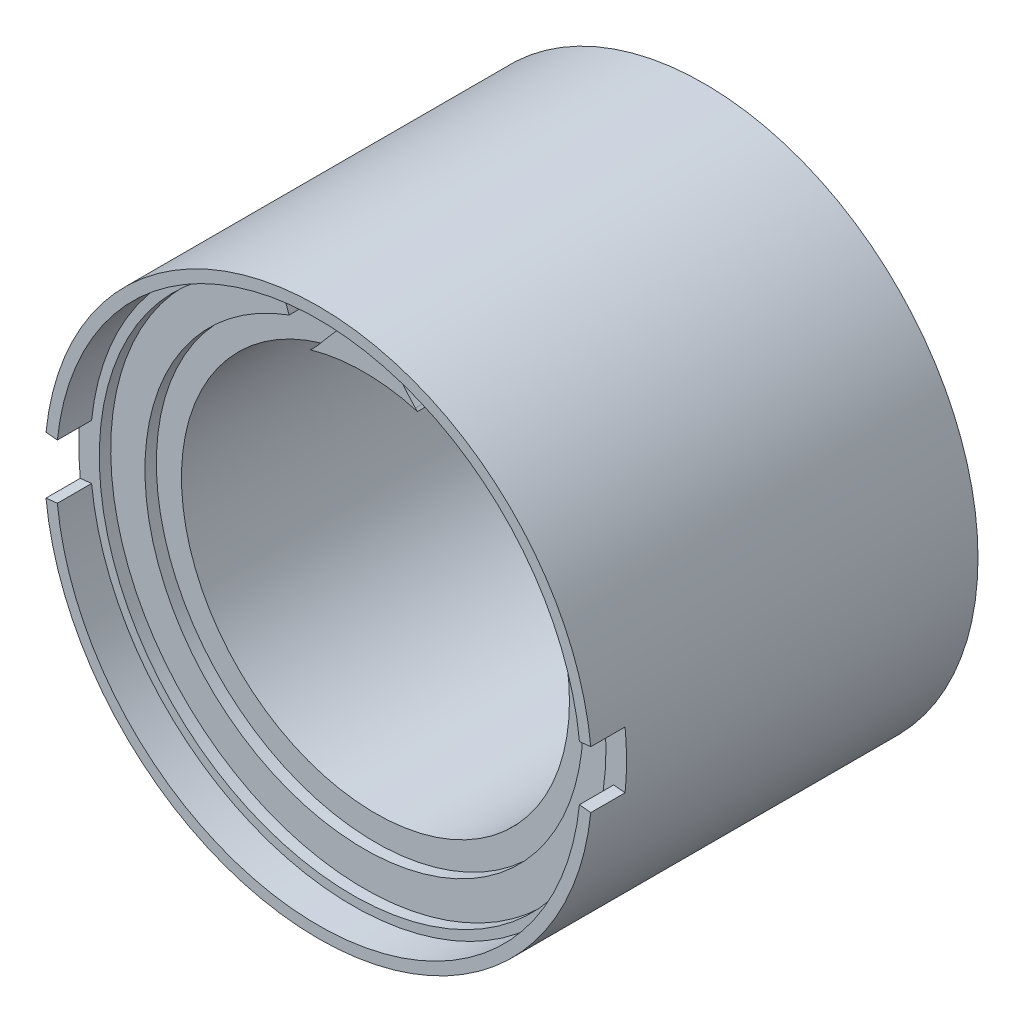
ISO-10303-21;
HEADER;
FILE_DESCRIPTION(('STEP AP214'),'2;1');
FILE_NAME('part.step','',(''),(''),'','','');
FILE_SCHEMA(('AUTOMOTIVE_DESIGN { 1 0 10303 214 1 1 1 1 }'));
ENDSEC;
DATA;
#1=APPLICATION_CONTEXT('core data for automotive mechanical design processes');
#2=APPLICATION_PROTOCOL_DEFINITION('international standard','automotive_design',2000,#1);
#3=PRODUCT_CONTEXT('',#1,'mechanical');
#4=PRODUCT('Part','Part','',(#3));
#5=PRODUCT_RELATED_PRODUCT_CATEGORY('part','',(#4));
#6=PRODUCT_DEFINITION_FORMATION('','',#4);
#7=PRODUCT_DEFINITION_CONTEXT('part definition',#1,'design');
#8=PRODUCT_DEFINITION('design','',#6,#7);
#9=PRODUCT_DEFINITION_SHAPE('','',#8);
#10=(LENGTH_UNIT() NAMED_UNIT(*) SI_UNIT(.MILLI.,.METRE.));
#11=(NAMED_UNIT(*) PLANE_ANGLE_UNIT() SI_UNIT($,.RADIAN.));
#12=(NAMED_UNIT(*) SI_UNIT($,.STERADIAN.) SOLID_ANGLE_UNIT());
#13=UNCERTAINTY_MEASURE_WITH_UNIT(LENGTH_MEASURE(1.E-05),#10,'distance_accuracy_value','');
#14=(GEOMETRIC_REPRESENTATION_CONTEXT(3) GLOBAL_UNCERTAINTY_ASSIGNED_CONTEXT((#13)) GLOBAL_UNIT_ASSIGNED_CONTEXT((#10,
#11,#12)) REPRESENTATION_CONTEXT('',''));
#15=CARTESIAN_POINT('',(0.,0.,0.));
#16=DIRECTION('',(0.,0.,1.));
#17=DIRECTION('',(1.,0.,0.));
#18=AXIS2_PLACEMENT_3D('',#15,#16,#17);
#19=CARTESIAN_POINT('',(0.,0.,1072.38147752167));
#20=DIRECTION('',(0.,0.,1.));
#21=DIRECTION('',(1.,0.,0.));
#22=AXIS2_PLACEMENT_3D('',#19,#20,#21);
#23=CYLINDRICAL_SURFACE('',#22,24.);
#24=CARTESIAN_POINT('',(0.,0.,0.));
#25=DIRECTION('',(0.,0.,1.));
#26=DIRECTION('',(1.,0.,0.));
#27=AXIS2_PLACEMENT_3D('',#24,#25,#26);
#28=CIRCLE('',#27,24.);
#29=CARTESIAN_POINT('',(24.,0.,0.));
#30=VERTEX_POINT('',#29);
#31=EDGE_CURVE('E235',#30,#30,#28,.T.);
#32=ORIENTED_EDGE('',*,*,#31,.T.);
#33=EDGE_LOOP('',(#32));
#34=FACE_BOUND('',#33,.T.);
#35=CARTESIAN_POINT('',(0.,0.,30.8));
#36=DIRECTION('',(0.,0.,1.));
#37=DIRECTION('',(1.,0.,0.));
#38=AXIS2_PLACEMENT_3D('',#35,#36,#37);
#39=CIRCLE('',#38,24.);
#40=CARTESIAN_POINT('',(23.86943652456,-2.5,30.8));
#41=VERTEX_POINT('',#40);
#42=CARTESIAN_POINT('',(23.86943652456,2.5,30.8));
#43=VERTEX_POINT('',#42);
#44=EDGE_CURVE('E174',#41,#43,#39,.T.);
#45=ORIENTED_EDGE('',*,*,#44,.F.);
#46=DIRECTION('',(0.,0.,1.));
#47=VECTOR('',#46,1.);
#48=CARTESIAN_POINT('',(23.86943652456,-2.5,30.8));
#49=LINE('',#48,#47);
#50=CARTESIAN_POINT('',(23.86943652456,-2.5,33.8));
#51=VERTEX_POINT('',#50);
#52=EDGE_CURVE('E498',#41,#51,#49,.T.);
#53=ORIENTED_EDGE('',*,*,#52,.T.);
#54=CARTESIAN_POINT('',(0.,0.,33.8));
#55=DIRECTION('',(0.,0.,1.));
#56=DIRECTION('',(1.,0.,0.));
#57=AXIS2_PLACEMENT_3D('',#54,#55,#56);
#58=CIRCLE('',#57,24.);
#59=CARTESIAN_POINT('',(-23.86943652456,-2.5,33.8));
#60=VERTEX_POINT('',#59);
#61=EDGE_CURVE('E230',#60,#51,#58,.T.);
#62=ORIENTED_EDGE('',*,*,#61,.F.);
#63=DIRECTION('',(0.,0.,1.));
#64=VECTOR('',#63,1.);
#65=CARTESIAN_POINT('',(-23.86943652456,-2.5,30.8));
#66=LINE('',#65,#64);
#67=CARTESIAN_POINT('',(-23.86943652456,-2.5,30.8));
#68=VERTEX_POINT('',#67);
#69=EDGE_CURVE('E207',#68,#60,#66,.T.);
#70=ORIENTED_EDGE('',*,*,#69,.F.);
#71=CARTESIAN_POINT('',(0.,0.,30.8));
#72=DIRECTION('',(0.,0.,1.));
#73=DIRECTION('',(1.,0.,0.));
#74=AXIS2_PLACEMENT_3D('',#71,#72,#73);
#75=CIRCLE('',#74,24.);
#76=CARTESIAN_POINT('',(-23.86943652456,2.5,30.8));
#77=VERTEX_POINT('',#76);
#78=EDGE_CURVE('E197',#77,#68,#75,.T.);
#79=ORIENTED_EDGE('',*,*,#78,.F.);
#80=DIRECTION('',(0.,0.,1.));
#81=VECTOR('',#80,1.);
#82=CARTESIAN_POINT('',(-23.86943652456,2.5,30.8));
#83=LINE('',#82,#81);
#84=CARTESIAN_POINT('',(-23.86943652456,2.5,33.8));
#85=VERTEX_POINT('',#84);
#86=EDGE_CURVE('E213',#77,#85,#83,.T.);
#87=ORIENTED_EDGE('',*,*,#86,.T.);
#88=CARTESIAN_POINT('',(23.86943652456,2.5,33.8));
#89=VERTEX_POINT('',#88);
#90=EDGE_CURVE('E187',#89,#85,#58,.T.);
#91=ORIENTED_EDGE('',*,*,#90,.F.);
#92=DIRECTION('',(0.,0.,1.));
#93=VECTOR('',#92,1.);
#94=CARTESIAN_POINT('',(23.86943652456,2.5,30.8));
#95=LINE('',#94,#93);
#96=EDGE_CURVE('E167',#43,#89,#95,.T.);
#97=ORIENTED_EDGE('',*,*,#96,.F.);
#98=EDGE_LOOP('',(#45,#53,#62,#70,#79,#87,#91,#97));
#99=FACE_BOUND('',#98,.T.);
#100=ADVANCED_FACE('F41',(#34,#99),#23,.T.);
#101=CARTESIAN_POINT('',(0.,0.,33.8));
#102=DIRECTION('',(0.,0.,1.));
#103=DIRECTION('',(1.,0.,0.));
#104=AXIS2_PLACEMENT_3D('',#101,#102,#103);
#105=PLANE('',#104);
#106=ORIENTED_EDGE('',*,*,#61,.T.);
#107=DIRECTION('',(-0.994559855190001,0.104166666666667,0.));
#108=VECTOR('',#107,1.);
#109=CARTESIAN_POINT('',(0.,0.,33.8));
#110=LINE('',#109,#108);
#111=CARTESIAN_POINT('',(22.87487666937,-2.39583333333333,33.8));
#112=VERTEX_POINT('',#111);
#113=EDGE_CURVE('E182',#51,#112,#110,.T.);
#114=ORIENTED_EDGE('',*,*,#113,.T.);
#115=CARTESIAN_POINT('',(0.,0.,33.8));
#116=DIRECTION('',(0.,0.,1.));
#117=DIRECTION('',(1.,0.,0.));
#118=AXIS2_PLACEMENT_3D('',#115,#116,#117);
#119=CIRCLE('',#118,23.);
#120=CARTESIAN_POINT('',(-22.87487666937,-2.39583333333333,33.8));
#121=VERTEX_POINT('',#120);
#122=EDGE_CURVE('E231',#121,#112,#119,.T.);
#123=ORIENTED_EDGE('',*,*,#122,.F.);
#124=DIRECTION('',(0.994559855190001,0.104166666666667,0.));
#125=VECTOR('',#124,1.);
#126=CARTESIAN_POINT('',(0.,0.,33.8));
#127=LINE('',#126,#125);
#128=EDGE_CURVE('E208',#60,#121,#127,.T.);
#129=ORIENTED_EDGE('',*,*,#128,.F.);
#130=EDGE_LOOP('',(#106,#114,#123,#129));
#131=FACE_BOUND('',#130,.T.);
#132=ADVANCED_FACE('F388',(#131),#105,.T.);
#133=CARTESIAN_POINT('',(22.87487666937,2.39583333333333,33.8));
#134=VERTEX_POINT('',#133);
#135=CARTESIAN_POINT('',(-22.87487666937,2.39583333333333,33.8));
#136=VERTEX_POINT('',#135);
#137=EDGE_CURVE('E226',#134,#136,#119,.T.);
#138=ORIENTED_EDGE('',*,*,#137,.F.);
#139=DIRECTION('',(0.994559855190001,0.104166666666667,0.));
#140=VECTOR('',#139,1.);
#141=CARTESIAN_POINT('',(0.,0.,33.8));
#142=LINE('',#141,#140);
#143=EDGE_CURVE('E216',#134,#89,#142,.T.);
#144=ORIENTED_EDGE('',*,*,#143,.T.);
#145=ORIENTED_EDGE('',*,*,#90,.T.);
#146=DIRECTION('',(-0.994559855190001,0.104166666666667,0.));
#147=VECTOR('',#146,1.);
#148=CARTESIAN_POINT('',(0.,0.,33.8));
#149=LINE('',#148,#147);
#150=EDGE_CURVE('E200',#136,#85,#149,.T.);
#151=ORIENTED_EDGE('',*,*,#150,.F.);
#152=EDGE_LOOP('',(#138,#144,#145,#151));
#153=FACE_BOUND('',#152,.T.);
#154=ADVANCED_FACE('F394',(#153),#105,.T.);
#155=CARTESIAN_POINT('',(0.,0.,33.8));
#156=DIRECTION('',(0.,0.,-1.));
#157=DIRECTION('',(-1.,0.,0.));
#158=AXIS2_PLACEMENT_3D('',#155,#156,#157);
#159=CYLINDRICAL_SURFACE('',#158,23.);
#160=ORIENTED_EDGE('',*,*,#122,.T.);
#161=DIRECTION('',(0.,0.,1.));
#162=VECTOR('',#161,1.);
#163=CARTESIAN_POINT('',(22.87487666937,-2.39583333333333,30.8));
#164=LINE('',#163,#162);
#165=CARTESIAN_POINT('',(22.87487666937,-2.39583333333333,30.8));
#166=VERTEX_POINT('',#165);
#167=EDGE_CURVE('E192',#166,#112,#164,.T.);
#168=ORIENTED_EDGE('',*,*,#167,.F.);
#169=CARTESIAN_POINT('',(0.,0.,30.8));
#170=DIRECTION('',(0.,0.,1.));
#171=DIRECTION('',(1.,0.,0.));
#172=AXIS2_PLACEMENT_3D('',#169,#170,#171);
#173=CIRCLE('',#172,23.);
#174=CARTESIAN_POINT('',(-22.87487666937,-2.39583333333333,30.8));
#175=VERTEX_POINT('',#174);
#176=EDGE_CURVE('E11',#166,#175,#173,.F.);
#177=ORIENTED_EDGE('',*,*,#176,.T.);
#178=DIRECTION('',(0.,0.,1.));
#179=VECTOR('',#178,1.);
#180=CARTESIAN_POINT('',(-22.87487666937,-2.39583333333333,30.8));
#181=LINE('',#180,#179);
#182=EDGE_CURVE('E220',#175,#121,#181,.T.);
#183=ORIENTED_EDGE('',*,*,#182,.T.);
#184=EDGE_LOOP('',(#160,#168,#177,#183));
#185=FACE_BOUND('',#184,.T.);
#186=ADVANCED_FACE('F518',(#185),#159,.F.);
#187=CARTESIAN_POINT('',(-22.87487666937,2.39583333333333,30.8));
#188=VERTEX_POINT('',#187);
#189=CARTESIAN_POINT('',(22.87487666937,2.39583333333333,30.8));
#190=VERTEX_POINT('',#189);
#191=EDGE_CURVE('E49',#188,#190,#173,.F.);
#192=ORIENTED_EDGE('',*,*,#191,.T.);
#193=DIRECTION('',(0.,0.,1.));
#194=VECTOR('',#193,1.);
#195=CARTESIAN_POINT('',(22.87487666937,2.39583333333333,30.8));
#196=LINE('',#195,#194);
#197=EDGE_CURVE('E170',#190,#134,#196,.T.);
#198=ORIENTED_EDGE('',*,*,#197,.T.);
#199=ORIENTED_EDGE('',*,*,#137,.T.);
#200=DIRECTION('',(0.,0.,1.));
#201=VECTOR('',#200,1.);
#202=CARTESIAN_POINT('',(-22.87487666937,2.39583333333333,30.8));
#203=LINE('',#202,#201);
#204=EDGE_CURVE('E217',#188,#136,#203,.T.);
#205=ORIENTED_EDGE('',*,*,#204,.F.);
#206=EDGE_LOOP('',(#192,#198,#199,#205));
#207=FACE_BOUND('',#206,.T.);
#208=ADVANCED_FACE('F384',(#207),#159,.F.);
#209=CARTESIAN_POINT('',(0.,0.,30.8));
#210=DIRECTION('',(0.,0.,1.));
#211=DIRECTION('',(1.,0.,0.));
#212=AXIS2_PLACEMENT_3D('',#209,#210,#211);
#213=PLANE('',#212);
#214=CARTESIAN_POINT('',(0.,0.,30.8));
#215=DIRECTION('',(0.,0.,1.));
#216=DIRECTION('',(1.,0.,0.));
#217=AXIS2_PLACEMENT_3D('',#214,#215,#216);
#218=CIRCLE('',#217,22.2);
#219=CARTESIAN_POINT('',(22.2,0.,30.8));
#220=VERTEX_POINT('',#219);
#221=EDGE_CURVE('E234',#220,#220,#218,.F.);
#222=ORIENTED_EDGE('',*,*,#221,.T.);
#223=EDGE_LOOP('',(#222));
#224=FACE_BOUND('',#223,.T.);
#225=ORIENTED_EDGE('',*,*,#176,.F.);
#226=DIRECTION('',(-0.994559855190001,0.104166666666667,0.));
#227=VECTOR('',#226,1.);
#228=CARTESIAN_POINT('',(0.,0.,30.8));
#229=LINE('',#228,#227);
#230=EDGE_CURVE('E173',#41,#166,#229,.T.);
#231=ORIENTED_EDGE('',*,*,#230,.F.);
#232=ORIENTED_EDGE('',*,*,#44,.T.);
#233=DIRECTION('',(0.994559855190001,0.104166666666667,0.));
#234=VECTOR('',#233,1.);
#235=CARTESIAN_POINT('',(0.,0.,30.8));
#236=LINE('',#235,#234);
#237=EDGE_CURVE('E56',#190,#43,#236,.T.);
#238=ORIENTED_EDGE('',*,*,#237,.F.);
#239=ORIENTED_EDGE('',*,*,#191,.F.);
#240=DIRECTION('',(-0.994559855190001,0.104166666666667,0.));
#241=VECTOR('',#240,1.);
#242=CARTESIAN_POINT('',(0.,0.,30.8));
#243=LINE('',#242,#241);
#244=EDGE_CURVE('E203',#188,#77,#243,.T.);
#245=ORIENTED_EDGE('',*,*,#244,.T.);
#246=ORIENTED_EDGE('',*,*,#78,.T.);
#247=DIRECTION('',(0.994559855190001,0.104166666666667,0.));
#248=VECTOR('',#247,1.);
#249=CARTESIAN_POINT('',(0.,0.,30.8));
#250=LINE('',#249,#248);
#251=EDGE_CURVE('E63',#68,#175,#250,.T.);
#252=ORIENTED_EDGE('',*,*,#251,.T.);
#253=EDGE_LOOP('',(#225,#231,#232,#238,#239,#245,#246,#252));
#254=FACE_BOUND('',#253,.T.);
#255=ADVANCED_FACE('F178',(#224,#254),#213,.T.);
#256=CARTESIAN_POINT('',(0.,0.,28.8));
#257=DIRECTION('',(0.,0.,1.));
#258=DIRECTION('',(1.,0.,0.));
#259=AXIS2_PLACEMENT_3D('',#256,#257,#258);
#260=CYLINDRICAL_SURFACE('',#259,22.2);
#261=CARTESIAN_POINT('',(0.,0.,29.8));
#262=DIRECTION('',(0.,0.,1.));
#263=DIRECTION('',(1.,0.,0.));
#264=AXIS2_PLACEMENT_3D('',#261,#262,#263);
#265=CIRCLE('',#264,22.2);
#266=CARTESIAN_POINT('',(-7.5928471818306,20.8611761814471,29.8));
#267=VERTEX_POINT('',#266);
#268=CARTESIAN_POINT('',(7.59284718183028,20.8611761814471,29.8));
#269=VERTEX_POINT('',#268);
#270=EDGE_CURVE('E323',#267,#269,#265,.T.);
#271=ORIENTED_EDGE('',*,*,#270,.F.);
#272=DIRECTION('',(0.,0.,1.));
#273=VECTOR('',#272,1.);
#274=CARTESIAN_POINT('',(-7.5928471818306,20.8611761814471,28.8));
#275=LINE('',#274,#273);
#276=CARTESIAN_POINT('',(-7.5928471818306,20.8611761814471,28.8));
#277=VERTEX_POINT('',#276);
#278=EDGE_CURVE('E437',#277,#267,#275,.T.);
#279=ORIENTED_EDGE('',*,*,#278,.F.);
#280=CARTESIAN_POINT('',(0.,0.,28.8));
#281=DIRECTION('',(0.,0.,1.));
#282=DIRECTION('',(1.,0.,0.));
#283=AXIS2_PLACEMENT_3D('',#280,#281,#282);
#284=CIRCLE('',#283,22.2);
#285=CARTESIAN_POINT('',(7.59284718183028,20.8611761814471,28.8));
#286=VERTEX_POINT('',#285);
#287=EDGE_CURVE('E260',#286,#277,#284,.T.);
#288=ORIENTED_EDGE('',*,*,#287,.F.);
#289=DIRECTION('',(0.,0.,1.));
#290=VECTOR('',#289,1.);
#291=CARTESIAN_POINT('',(7.59284718183028,20.8611761814471,28.8));
#292=LINE('',#291,#290);
#293=EDGE_CURVE('E440',#286,#269,#292,.T.);
#294=ORIENTED_EDGE('',*,*,#293,.T.);
#295=EDGE_LOOP('',(#271,#279,#288,#294));
#296=FACE_BOUND('',#295,.T.);
#297=ORIENTED_EDGE('',*,*,#221,.F.);
#298=EDGE_LOOP('',(#297));
#299=FACE_BOUND('',#298,.T.);
#300=ADVANCED_FACE('F360',(#296,#299),#260,.F.);
#301=CARTESIAN_POINT('',(0.,0.,1072.38147752167));
#302=DIRECTION('',(0.,0.,1.));
#303=DIRECTION('',(1.,0.,0.));
#304=AXIS2_PLACEMENT_3D('',#301,#302,#303);
#305=CYLINDRICAL_SURFACE('',#304,17.);
#306=CARTESIAN_POINT('',(0.,0.,1.80000000000002));
#307=DIRECTION('',(0.,0.,1.));
#308=DIRECTION('',(1.,0.,0.));
#309=AXIS2_PLACEMENT_3D('',#306,#307,#308);
#310=CIRCLE('',#309,17.);
#311=CARTESIAN_POINT('',(17.,0.,1.80000000000002));
#312=VERTEX_POINT('',#311);
#313=EDGE_CURVE('E239',#312,#312,#310,.T.);
#314=ORIENTED_EDGE('',*,*,#313,.F.);
#315=EDGE_LOOP('',(#314));
#316=FACE_BOUND('',#315,.T.);
#317=CARTESIAN_POINT('',(0.,0.,29.8));
#318=DIRECTION('',(0.,0.,1.));
#319=DIRECTION('',(1.,0.,0.));
#320=AXIS2_PLACEMENT_3D('',#317,#318,#319);
#321=CIRCLE('',#320,17.);
#322=CARTESIAN_POINT('',(-4.68397596917369,16.3419817990415,29.8));
#323=VERTEX_POINT('',#322);
#324=CARTESIAN_POINT('',(4.68397596917369,16.3419817990415,29.8));
#325=VERTEX_POINT('',#324);
#326=EDGE_CURVE('E285',#323,#325,#321,.F.);
#327=ORIENTED_EDGE('',*,*,#326,.F.);
#328=DIRECTION('',(0.,0.,1.));
#329=VECTOR('',#328,1.);
#330=CARTESIAN_POINT('',(-4.68397596917369,16.3419817990415,28.8));
#331=LINE('',#330,#329);
#332=CARTESIAN_POINT('',(-4.68397596917369,16.3419817990415,28.8));
#333=VERTEX_POINT('',#332);
#334=EDGE_CURVE('E454',#333,#323,#331,.T.);
#335=ORIENTED_EDGE('',*,*,#334,.F.);
#336=CARTESIAN_POINT('',(0.,0.,28.8));
#337=DIRECTION('',(0.,0.,1.));
#338=DIRECTION('',(1.,0.,0.));
#339=AXIS2_PLACEMENT_3D('',#336,#337,#338);
#340=CIRCLE('',#339,17.);
#341=CARTESIAN_POINT('',(4.68397596917369,16.3419817990415,28.8));
#342=VERTEX_POINT('',#341);
#343=EDGE_CURVE('E271',#333,#342,#340,.T.);
#344=ORIENTED_EDGE('',*,*,#343,.T.);
#345=DIRECTION('',(0.,0.,1.));
#346=VECTOR('',#345,1.);
#347=CARTESIAN_POINT('',(4.68397596917369,16.3419817990415,28.8));
#348=LINE('',#347,#346);
#349=EDGE_CURVE('E458',#342,#325,#348,.T.);
#350=ORIENTED_EDGE('',*,*,#349,.T.);
#351=EDGE_LOOP('',(#327,#335,#344,#350));
#352=FACE_BOUND('',#351,.T.);
#353=ADVANCED_FACE('F356',(#316,#352),#305,.F.);
#354=CARTESIAN_POINT('',(0.,0.,28.8));
#355=DIRECTION('',(0.939692620785902,-0.342020143325687,0.));
#356=DIRECTION('',(0.342020143325687,0.939692620785902,0.));
#357=AXIS2_PLACEMENT_3D('',#354,#355,#356);
#358=PLANE('',#357);
#359=DIRECTION('',(0.342020143325687,0.939692620785902,0.));
#360=VECTOR('',#359,1.);
#361=CARTESIAN_POINT('',(0.,0.,29.8));
#362=LINE('',#361,#360);
#363=CARTESIAN_POINT('',(6.56678675185322,18.0420983190894,29.8));
#364=VERTEX_POINT('',#363);
#365=EDGE_CURVE('E319',#364,#269,#362,.T.);
#366=ORIENTED_EDGE('',*,*,#365,.T.);
#367=ORIENTED_EDGE('',*,*,#293,.F.);
#368=DIRECTION('',(0.342020143325687,0.939692620785902,0.));
#369=VECTOR('',#368,1.);
#370=CARTESIAN_POINT('',(0.,0.,28.8));
#371=LINE('',#370,#369);
#372=CARTESIAN_POINT('',(6.56678675185322,18.0420983190894,28.8));
#373=VERTEX_POINT('',#372);
#374=EDGE_CURVE('E264',#373,#286,#371,.T.);
#375=ORIENTED_EDGE('',*,*,#374,.F.);
#376=DIRECTION('',(0.,0.,1.));
#377=VECTOR('',#376,1.);
#378=CARTESIAN_POINT('',(6.56678675185322,18.0420983190894,28.8));
#379=LINE('',#378,#377);
#380=EDGE_CURVE('E251',#373,#364,#379,.T.);
#381=ORIENTED_EDGE('',*,*,#380,.T.);
#382=EDGE_LOOP('',(#366,#367,#375,#381));
#383=FACE_BOUND('',#382,.T.);
#384=ADVANCED_FACE('F359',(#383),#358,.F.);
#385=CARTESIAN_POINT('',(0.,0.,28.8));
#386=DIRECTION('',(0.,0.,1.));
#387=DIRECTION('',(1.,0.,0.));
#388=AXIS2_PLACEMENT_3D('',#385,#386,#387);
#389=CYLINDRICAL_SURFACE('',#388,19.2);
#390=DIRECTION('',(0.,0.,1.));
#391=VECTOR('',#390,1.);
#392=CARTESIAN_POINT('',(-6.56678675185351,18.0420983190894,28.8));
#393=LINE('',#392,#391);
#394=CARTESIAN_POINT('',(-6.56678675185351,18.0420983190894,28.8));
#395=VERTEX_POINT('',#394);
#396=CARTESIAN_POINT('',(-6.56678675185351,18.0420983190894,29.8));
#397=VERTEX_POINT('',#396);
#398=EDGE_CURVE('E441',#395,#397,#393,.T.);
#399=ORIENTED_EDGE('',*,*,#398,.T.);
#400=CARTESIAN_POINT('',(0.,0.,29.8));
#401=DIRECTION('',(0.,0.,1.));
#402=DIRECTION('',(1.,0.,0.));
#403=AXIS2_PLACEMENT_3D('',#400,#401,#402);
#404=CIRCLE('',#403,19.2);
#405=EDGE_CURVE('E316',#364,#397,#404,.F.);
#406=ORIENTED_EDGE('',*,*,#405,.F.);
#407=ORIENTED_EDGE('',*,*,#380,.F.);
#408=CARTESIAN_POINT('',(0.,0.,28.8));
#409=DIRECTION('',(0.,0.,1.));
#410=DIRECTION('',(1.,0.,0.));
#411=AXIS2_PLACEMENT_3D('',#408,#409,#410);
#412=CIRCLE('',#411,19.2);
#413=EDGE_CURVE('E252',#373,#395,#412,.F.);
#414=ORIENTED_EDGE('',*,*,#413,.T.);
#415=EDGE_LOOP('',(#399,#406,#407,#414));
#416=FACE_BOUND('',#415,.T.);
#417=ADVANCED_FACE('F370',(#416),#389,.F.);
#418=CARTESIAN_POINT('',(0.,0.,28.8));
#419=DIRECTION('',(0.939692620785897,0.342020143325699,0.));
#420=DIRECTION('',(-0.342020143325699,0.939692620785897,0.));
#421=AXIS2_PLACEMENT_3D('',#418,#419,#420);
#422=PLANE('',#421);
#423=ORIENTED_EDGE('',*,*,#278,.T.);
#424=DIRECTION('',(-0.342020143325699,0.939692620785897,0.));
#425=VECTOR('',#424,1.);
#426=CARTESIAN_POINT('',(0.,0.,29.8));
#427=LINE('',#426,#425);
#428=EDGE_CURVE('E326',#397,#267,#427,.T.);
#429=ORIENTED_EDGE('',*,*,#428,.F.);
#430=ORIENTED_EDGE('',*,*,#398,.F.);
#431=DIRECTION('',(-0.342020143325699,0.939692620785897,0.));
#432=VECTOR('',#431,1.);
#433=CARTESIAN_POINT('',(0.,0.,28.8));
#434=LINE('',#433,#432);
#435=EDGE_CURVE('E256',#395,#277,#434,.T.);
#436=ORIENTED_EDGE('',*,*,#435,.T.);
#437=EDGE_LOOP('',(#423,#429,#430,#436));
#438=FACE_BOUND('',#437,.T.);
#439=ADVANCED_FACE('F368',(#438),#422,.T.);
#440=CARTESIAN_POINT('',(-1.,19.9722249756745,28.8));
#441=CARTESIAN_POINT('',(-1.83751743884076,19.9722249756745,28.8));
#442=CARTESIAN_POINT('',(-3.40068888477795,17.6065514435698,28.8));
#443=CARTESIAN_POINT('',(-4.50526886810057,16.5180823598799,28.8));
#444=B_SPLINE_CURVE_WITH_KNOTS('',3,(#440,#441,#442,#443),.UNSPECIFIED.,.F.,.F.,(4,4),(0.,1.),.UNSPECIFIED.);
#445=DIRECTION('',(0.,0.,1.));
#446=VECTOR('',#445,1.);
#447=SURFACE_OF_LINEAR_EXTRUSION('',#444,#446);
#448=DIRECTION('',(0.,0.,1.));
#449=VECTOR('',#448,1.);
#450=CARTESIAN_POINT('',(-4.50526886810057,16.5180823598799,28.8));
#451=LINE('',#450,#449);
#452=CARTESIAN_POINT('',(-4.50526886810057,16.5180823598799,28.8));
#453=VERTEX_POINT('',#452);
#454=CARTESIAN_POINT('',(-4.50526886810057,16.5180823598799,29.8));
#455=VERTEX_POINT('',#454);
#456=EDGE_CURVE('E446',#453,#455,#451,.T.);
#457=ORIENTED_EDGE('',*,*,#456,.T.);
#458=CARTESIAN_POINT('',(-1.,19.9722249756745,29.8));
#459=CARTESIAN_POINT('',(-1.83751743884076,19.9722249756745,29.8));
#460=CARTESIAN_POINT('',(-3.40068888477795,17.6065514435698,29.8));
#461=CARTESIAN_POINT('',(-4.50526886810057,16.5180823598799,29.8));
#462=B_SPLINE_CURVE_WITH_KNOTS('',3,(#458,#459,#460,#461),.UNSPECIFIED.,.F.,.F.,(4,4),(0.,1.),.UNSPECIFIED.);
#463=CARTESIAN_POINT('',(-1.,19.9722249756745,29.8));
#464=VERTEX_POINT('',#463);
#465=EDGE_CURVE('E291',#464,#455,#462,.T.);
#466=ORIENTED_EDGE('',*,*,#465,.F.);
#467=DIRECTION('',(0.,0.,1.));
#468=VECTOR('',#467,1.);
#469=CARTESIAN_POINT('',(-1.,19.9722249756745,28.8));
#470=LINE('',#469,#468);
#471=CARTESIAN_POINT('',(-1.,19.9722249756745,28.8));
#472=VERTEX_POINT('',#471);
#473=EDGE_CURVE('E257',#472,#464,#470,.T.);
#474=ORIENTED_EDGE('',*,*,#473,.F.);
#475=EDGE_CURVE('E284',#472,#453,#444,.T.);
#476=ORIENTED_EDGE('',*,*,#475,.T.);
#477=EDGE_LOOP('',(#457,#466,#474,#476));
#478=FACE_BOUND('',#477,.T.);
#479=ADVANCED_FACE('F364',(#478),#447,.T.);
#480=CARTESIAN_POINT('',(-10.4776887180417,10.6327735007392,28.8));
#481=DIRECTION('',(-0.701893189425482,0.712282212776737,0.));
#482=DIRECTION('',(-0.712282212776737,-0.701893189425482,0.));
#483=AXIS2_PLACEMENT_3D('',#480,#481,#482);
#484=PLANE('',#483);
#485=ORIENTED_EDGE('',*,*,#334,.T.);
#486=DIRECTION('',(-0.712282212776737,-0.701893189425482,0.));
#487=VECTOR('',#486,1.);
#488=CARTESIAN_POINT('',(-10.4776887180417,10.6327735007392,29.8));
#489=LINE('',#488,#487);
#490=EDGE_CURVE('E288',#455,#323,#489,.T.);
#491=ORIENTED_EDGE('',*,*,#490,.F.);
#492=ORIENTED_EDGE('',*,*,#456,.F.);
#493=DIRECTION('',(-0.712282212776737,-0.701893189425482,0.));
#494=VECTOR('',#493,1.);
#495=CARTESIAN_POINT('',(-10.4776887180417,10.6327735007392,28.8));
#496=LINE('',#495,#494);
#497=EDGE_CURVE('E268',#453,#333,#496,.T.);
#498=ORIENTED_EDGE('',*,*,#497,.T.);
#499=EDGE_LOOP('',(#485,#491,#492,#498));
#500=FACE_BOUND('',#499,.T.);
#501=ADVANCED_FACE('F354',(#500),#484,.T.);
#502=CARTESIAN_POINT('',(10.4776887180417,10.6327735007392,28.8));
#503=DIRECTION('',(-0.701893189425482,-0.712282212776737,0.));
#504=DIRECTION('',(0.712282212776737,-0.701893189425482,0.));
#505=AXIS2_PLACEMENT_3D('',#502,#503,#504);
#506=PLANE('',#505);
#507=DIRECTION('',(0.712282212776737,-0.701893189425482,0.));
#508=VECTOR('',#507,1.);
#509=CARTESIAN_POINT('',(10.4776887180417,10.6327735007392,29.8));
#510=LINE('',#509,#508);
#511=CARTESIAN_POINT('',(4.50526886810057,16.5180823598799,29.8));
#512=VERTEX_POINT('',#511);
#513=EDGE_CURVE('E309',#512,#325,#510,.T.);
#514=ORIENTED_EDGE('',*,*,#513,.T.);
#515=ORIENTED_EDGE('',*,*,#349,.F.);
#516=DIRECTION('',(0.712282212776737,-0.701893189425482,0.));
#517=VECTOR('',#516,1.);
#518=CARTESIAN_POINT('',(10.4776887180417,10.6327735007392,28.8));
#519=LINE('',#518,#517);
#520=CARTESIAN_POINT('',(4.50526886810057,16.5180823598799,28.8));
#521=VERTEX_POINT('',#520);
#522=EDGE_CURVE('E275',#521,#342,#519,.T.);
#523=ORIENTED_EDGE('',*,*,#522,.F.);
#524=DIRECTION('',(0.,0.,1.));
#525=VECTOR('',#524,1.);
#526=CARTESIAN_POINT('',(4.50526886810057,16.5180823598799,28.8));
#527=LINE('',#526,#525);
#528=EDGE_CURVE('E462',#521,#512,#527,.T.);
#529=ORIENTED_EDGE('',*,*,#528,.T.);
#530=EDGE_LOOP('',(#514,#515,#523,#529));
#531=FACE_BOUND('',#530,.T.);
#532=ADVANCED_FACE('F349',(#531),#506,.F.);
#533=CARTESIAN_POINT('',(1.,19.9722249756745,28.8));
#534=CARTESIAN_POINT('',(1.83751743884076,19.9722249756745,28.8));
#535=CARTESIAN_POINT('',(3.40068888477795,17.6065514435698,28.8));
#536=CARTESIAN_POINT('',(4.50526886810057,16.5180823598799,28.8));
#537=B_SPLINE_CURVE_WITH_KNOTS('',3,(#533,#534,#535,#536),.UNSPECIFIED.,.F.,.F.,(4,4),(0.,1.),.UNSPECIFIED.);
#538=DIRECTION('',(0.,0.,1.));
#539=VECTOR('',#538,1.);
#540=SURFACE_OF_LINEAR_EXTRUSION('',#537,#539);
#541=CARTESIAN_POINT('',(1.,19.9722249756745,29.8));
#542=CARTESIAN_POINT('',(1.83751743884076,19.9722249756745,29.8));
#543=CARTESIAN_POINT('',(3.40068888477795,17.6065514435698,29.8));
#544=CARTESIAN_POINT('',(4.50526886810057,16.5180823598799,29.8));
#545=B_SPLINE_CURVE_WITH_KNOTS('',3,(#541,#542,#543,#544),.UNSPECIFIED.,.F.,.F.,(4,4),(0.,1.),.UNSPECIFIED.);
#546=CARTESIAN_POINT('',(1.,19.9722249756745,29.8));
#547=VERTEX_POINT('',#546);
#548=EDGE_CURVE('E303',#547,#512,#545,.T.);
#549=ORIENTED_EDGE('',*,*,#548,.T.);
#550=ORIENTED_EDGE('',*,*,#528,.F.);
#551=CARTESIAN_POINT('',(1.,19.9722249756745,28.8));
#552=VERTEX_POINT('',#551);
#553=EDGE_CURVE('E279',#552,#521,#537,.T.);
#554=ORIENTED_EDGE('',*,*,#553,.F.);
#555=DIRECTION('',(0.,0.,1.));
#556=VECTOR('',#555,1.);
#557=CARTESIAN_POINT('',(1.,19.9722249756745,28.8));
#558=LINE('',#557,#556);
#559=EDGE_CURVE('E466',#552,#547,#558,.T.);
#560=ORIENTED_EDGE('',*,*,#559,.T.);
#561=EDGE_LOOP('',(#549,#550,#554,#560));
#562=FACE_BOUND('',#561,.T.);
#563=ADVANCED_FACE('F344',(#562),#540,.F.);
#564=CARTESIAN_POINT('',(0.,19.9722249756745,28.8));
#565=DIRECTION('',(0.,-1.,0.));
#566=DIRECTION('',(0.,0.,-1.));
#567=AXIS2_PLACEMENT_3D('',#564,#565,#566);
#568=PLANE('',#567);
#569=DIRECTION('',(1.,0.,0.));
#570=VECTOR('',#569,1.);
#571=CARTESIAN_POINT('',(0.,19.9722249756745,29.8));
#572=LINE('',#571,#570);
#573=EDGE_CURVE('E296',#464,#547,#572,.T.);
#574=ORIENTED_EDGE('',*,*,#573,.T.);
#575=ORIENTED_EDGE('',*,*,#559,.F.);
#576=DIRECTION('',(1.,0.,0.));
#577=VECTOR('',#576,1.);
#578=CARTESIAN_POINT('',(0.,19.9722249756745,28.8));
#579=LINE('',#578,#577);
#580=EDGE_CURVE('E280',#472,#552,#579,.T.);
#581=ORIENTED_EDGE('',*,*,#580,.F.);
#582=ORIENTED_EDGE('',*,*,#473,.T.);
#583=EDGE_LOOP('',(#574,#575,#581,#582));
#584=FACE_BOUND('',#583,.T.);
#585=ADVANCED_FACE('F348',(#584),#568,.F.);
#586=CARTESIAN_POINT('',(0.,0.,0.));
#587=DIRECTION('',(0.,0.,1.));
#588=DIRECTION('',(1.,0.,0.));
#589=AXIS2_PLACEMENT_3D('',#586,#587,#588);
#590=PLANE('',#589);
#591=ORIENTED_EDGE('',*,*,#31,.F.);
#592=EDGE_LOOP('',(#591));
#593=FACE_BOUND('',#592,.T.);
#594=CARTESIAN_POINT('',(0.,0.,0.));
#595=DIRECTION('',(0.,0.,1.));
#596=DIRECTION('',(1.,0.,0.));
#597=AXIS2_PLACEMENT_3D('',#594,#595,#596);
#598=CIRCLE('',#597,13.);
#599=CARTESIAN_POINT('',(13.,0.,0.));
#600=VERTEX_POINT('',#599);
#601=EDGE_CURVE('E247',#600,#600,#598,.T.);
#602=ORIENTED_EDGE('',*,*,#601,.T.);
#603=EDGE_LOOP('',(#602));
#604=FACE_BOUND('',#603,.T.);
#605=ADVANCED_FACE('F399',(#593,#604),#590,.F.);
#606=CARTESIAN_POINT('',(0.,0.,1.8));
#607=DIRECTION('',(0.,0.,1.));
#608=DIRECTION('',(1.,0.,0.));
#609=AXIS2_PLACEMENT_3D('',#606,#607,#608);
#610=PLANE('',#609);
#611=ORIENTED_EDGE('',*,*,#313,.T.);
#612=EDGE_LOOP('',(#611));
#613=FACE_BOUND('',#612,.T.);
#614=CARTESIAN_POINT('',(0.,0.,1.80000000000002));
#615=DIRECTION('',(0.,0.,1.));
#616=DIRECTION('',(1.,0.,0.));
#617=AXIS2_PLACEMENT_3D('',#614,#615,#616);
#618=CIRCLE('',#617,13.);
#619=CARTESIAN_POINT('',(13.,0.,1.80000000000002));
#620=VERTEX_POINT('',#619);
#621=EDGE_CURVE('E243',#620,#620,#618,.T.);
#622=ORIENTED_EDGE('',*,*,#621,.F.);
#623=EDGE_LOOP('',(#622));
#624=FACE_BOUND('',#623,.T.);
#625=ADVANCED_FACE('F402',(#613,#624),#610,.T.);
#626=CARTESIAN_POINT('',(0.,0.,1072.38147752167));
#627=DIRECTION('',(0.,0.,1.));
#628=DIRECTION('',(1.,0.,0.));
#629=AXIS2_PLACEMENT_3D('',#626,#627,#628);
#630=CYLINDRICAL_SURFACE('',#629,13.);
#631=ORIENTED_EDGE('',*,*,#601,.F.);
#632=EDGE_LOOP('',(#631));
#633=FACE_BOUND('',#632,.T.);
#634=ORIENTED_EDGE('',*,*,#621,.T.);
#635=EDGE_LOOP('',(#634));
#636=FACE_BOUND('',#635,.T.);
#637=ADVANCED_FACE('F406',(#633,#636),#630,.F.);
#638=CARTESIAN_POINT('',(0.,0.,28.8));
#639=DIRECTION('',(0.,0.,1.));
#640=DIRECTION('',(1.,0.,0.));
#641=AXIS2_PLACEMENT_3D('',#638,#639,#640);
#642=PLANE('',#641);
#643=ORIENTED_EDGE('',*,*,#475,.F.);
#644=ORIENTED_EDGE('',*,*,#580,.T.);
#645=ORIENTED_EDGE('',*,*,#553,.T.);
#646=ORIENTED_EDGE('',*,*,#522,.T.);
#647=ORIENTED_EDGE('',*,*,#343,.F.);
#648=ORIENTED_EDGE('',*,*,#497,.F.);
#649=EDGE_LOOP('',(#643,#644,#645,#646,#647,#648));
#650=FACE_BOUND('',#649,.T.);
#651=ORIENTED_EDGE('',*,*,#374,.T.);
#652=ORIENTED_EDGE('',*,*,#287,.T.);
#653=ORIENTED_EDGE('',*,*,#435,.F.);
#654=ORIENTED_EDGE('',*,*,#413,.F.);
#655=EDGE_LOOP('',(#651,#652,#653,#654));
#656=FACE_BOUND('',#655,.T.);
#657=ADVANCED_FACE('F409',(#650,#656),#642,.T.);
#658=CARTESIAN_POINT('',(0.,0.,29.8));
#659=DIRECTION('',(0.,0.,1.));
#660=DIRECTION('',(1.,0.,0.));
#661=AXIS2_PLACEMENT_3D('',#658,#659,#660);
#662=PLANE('',#661);
#663=ORIENTED_EDGE('',*,*,#428,.T.);
#664=ORIENTED_EDGE('',*,*,#270,.T.);
#665=ORIENTED_EDGE('',*,*,#365,.F.);
#666=ORIENTED_EDGE('',*,*,#405,.T.);
#667=EDGE_LOOP('',(#663,#664,#665,#666));
#668=FACE_BOUND('',#667,.T.);
#669=ADVANCED_FACE('F421',(#668),#662,.T.);
#670=CARTESIAN_POINT('',(0.,0.,29.8));
#671=DIRECTION('',(0.,0.,1.));
#672=DIRECTION('',(1.,0.,0.));
#673=AXIS2_PLACEMENT_3D('',#670,#671,#672);
#674=PLANE('',#673);
#675=ORIENTED_EDGE('',*,*,#326,.T.);
#676=ORIENTED_EDGE('',*,*,#513,.F.);
#677=ORIENTED_EDGE('',*,*,#548,.F.);
#678=ORIENTED_EDGE('',*,*,#573,.F.);
#679=ORIENTED_EDGE('',*,*,#465,.T.);
#680=ORIENTED_EDGE('',*,*,#490,.T.);
#681=EDGE_LOOP('',(#675,#676,#677,#678,#679,#680));
#682=FACE_BOUND('',#681,.T.);
#683=ADVANCED_FACE('F423',(#682),#674,.T.);
#684=CARTESIAN_POINT('',(0.,0.,30.8));
#685=DIRECTION('',(0.104166666666667,0.994559855190001,0.));
#686=DIRECTION('',(-0.994559855190001,0.104166666666667,0.));
#687=AXIS2_PLACEMENT_3D('',#684,#685,#686);
#688=PLANE('',#687);
#689=ORIENTED_EDGE('',*,*,#150,.T.);
#690=ORIENTED_EDGE('',*,*,#86,.F.);
#691=ORIENTED_EDGE('',*,*,#244,.F.);
#692=ORIENTED_EDGE('',*,*,#204,.T.);
#693=EDGE_LOOP('',(#689,#690,#691,#692));
#694=FACE_BOUND('',#693,.T.);
#695=ADVANCED_FACE('F425',(#694),#688,.F.);
#696=CARTESIAN_POINT('',(0.,0.,30.8));
#697=DIRECTION('',(0.104166666666667,-0.994559855190001,0.));
#698=DIRECTION('',(0.994559855190001,0.104166666666667,0.));
#699=AXIS2_PLACEMENT_3D('',#696,#697,#698);
#700=PLANE('',#699);
#701=ORIENTED_EDGE('',*,*,#128,.T.);
#702=ORIENTED_EDGE('',*,*,#182,.F.);
#703=ORIENTED_EDGE('',*,*,#251,.F.);
#704=ORIENTED_EDGE('',*,*,#69,.T.);
#705=EDGE_LOOP('',(#701,#702,#703,#704));
#706=FACE_BOUND('',#705,.T.);
#707=ADVANCED_FACE('F491',(#706),#700,.F.);
#708=CARTESIAN_POINT('',(0.,0.,30.8));
#709=DIRECTION('',(0.104166666666667,0.994559855190001,0.));
#710=DIRECTION('',(-0.994559855190001,0.104166666666667,0.));
#711=AXIS2_PLACEMENT_3D('',#708,#709,#710);
#712=PLANE('',#711);
#713=ORIENTED_EDGE('',*,*,#113,.F.);
#714=ORIENTED_EDGE('',*,*,#52,.F.);
#715=ORIENTED_EDGE('',*,*,#230,.T.);
#716=ORIENTED_EDGE('',*,*,#167,.T.);
#717=EDGE_LOOP('',(#713,#714,#715,#716));
#718=FACE_BOUND('',#717,.T.);
#719=ADVANCED_FACE('F513',(#718),#712,.T.);
#720=CARTESIAN_POINT('',(0.,0.,30.8));
#721=DIRECTION('',(0.104166666666667,-0.994559855190001,0.));
#722=DIRECTION('',(0.994559855190001,0.104166666666667,0.));
#723=AXIS2_PLACEMENT_3D('',#720,#721,#722);
#724=PLANE('',#723);
#725=ORIENTED_EDGE('',*,*,#143,.F.);
#726=ORIENTED_EDGE('',*,*,#197,.F.);
#727=ORIENTED_EDGE('',*,*,#237,.T.);
#728=ORIENTED_EDGE('',*,*,#96,.T.);
#729=EDGE_LOOP('',(#725,#726,#727,#728));
#730=FACE_BOUND('',#729,.T.);
#731=ADVANCED_FACE('F165',(#730),#724,.T.);
#732=CLOSED_SHELL('',(#100,#132,#154,#186,#208,#255,#300,#353,#384,#417,#439,#479,#501,#532,
#563,#585,#605,#625,#637,#657,#669,#683,#695,#707,#719,#731));
#733=MANIFOLD_SOLID_BREP('B2',#732);
#734=ADVANCED_BREP_SHAPE_REPRESENTATION('',(#18,#733),#14);
#735=SHAPE_DEFINITION_REPRESENTATION(#9,#734);
ENDSEC;
END-ISO-10303-21;
